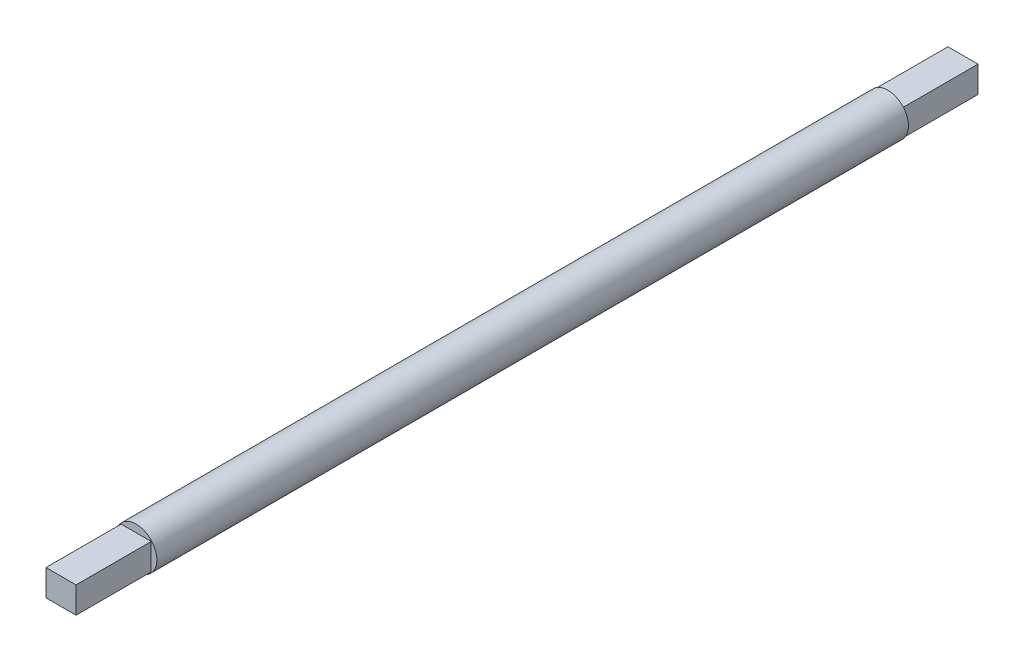
ISO-10303-21;
HEADER;
FILE_DESCRIPTION(('STEP AP214'),'2;1');
FILE_NAME('part.step','',(''),(''),'','','');
FILE_SCHEMA(('AUTOMOTIVE_DESIGN { 1 0 10303 214 1 1 1 1 }'));
ENDSEC;
DATA;
#1=APPLICATION_CONTEXT('core data for automotive mechanical design processes');
#2=APPLICATION_PROTOCOL_DEFINITION('international standard','automotive_design',2000,#1);
#3=PRODUCT_CONTEXT('',#1,'mechanical');
#4=PRODUCT('Part','Part','',(#3));
#5=PRODUCT_RELATED_PRODUCT_CATEGORY('part','',(#4));
#6=PRODUCT_DEFINITION_FORMATION('','',#4);
#7=PRODUCT_DEFINITION_CONTEXT('part definition',#1,'design');
#8=PRODUCT_DEFINITION('design','',#6,#7);
#9=PRODUCT_DEFINITION_SHAPE('','',#8);
#10=(LENGTH_UNIT() NAMED_UNIT(*) SI_UNIT(.MILLI.,.METRE.));
#11=(NAMED_UNIT(*) PLANE_ANGLE_UNIT() SI_UNIT($,.RADIAN.));
#12=(NAMED_UNIT(*) SI_UNIT($,.STERADIAN.) SOLID_ANGLE_UNIT());
#13=UNCERTAINTY_MEASURE_WITH_UNIT(LENGTH_MEASURE(1.E-05),#10,'distance_accuracy_value','');
#14=(GEOMETRIC_REPRESENTATION_CONTEXT(3) GLOBAL_UNCERTAINTY_ASSIGNED_CONTEXT((#13)) GLOBAL_UNIT_ASSIGNED_CONTEXT((#10,
#11,#12)) REPRESENTATION_CONTEXT('',''));
#15=CARTESIAN_POINT('',(0.,0.,0.));
#16=DIRECTION('',(0.,0.,1.));
#17=DIRECTION('',(1.,0.,0.));
#18=AXIS2_PLACEMENT_3D('',#15,#16,#17);
#19=CARTESIAN_POINT('',(0.,0.,0.));
#20=DIRECTION('',(0.,0.,1.));
#21=DIRECTION('',(1.,0.,0.));
#22=AXIS2_PLACEMENT_3D('',#19,#20,#21);
#23=PLANE('',#22);
#24=CARTESIAN_POINT('',(0.,0.,0.));
#25=DIRECTION('',(0.,0.,1.));
#26=DIRECTION('',(1.,0.,0.));
#27=AXIS2_PLACEMENT_3D('',#24,#25,#26);
#28=CIRCLE('',#27,2.75);
#29=CARTESIAN_POINT('',(2.75,0.,0.));
#30=VERTEX_POINT('',#29);
#31=EDGE_CURVE('E37',#30,#30,#28,.T.);
#32=ORIENTED_EDGE('',*,*,#31,.F.);
#33=EDGE_LOOP('',(#32));
#34=FACE_BOUND('',#33,.T.);
#35=DIRECTION('',(0.,-1.,0.));
#36=VECTOR('',#35,1.);
#37=CARTESIAN_POINT('',(2.,1.75,0.));
#38=LINE('',#37,#36);
#39=CARTESIAN_POINT('',(2.,1.75,0.));
#40=VERTEX_POINT('',#39);
#41=CARTESIAN_POINT('',(2.,-1.75,0.));
#42=VERTEX_POINT('',#41);
#43=EDGE_CURVE('E118',#40,#42,#38,.T.);
#44=ORIENTED_EDGE('',*,*,#43,.F.);
#45=DIRECTION('',(1.,0.,0.));
#46=VECTOR('',#45,1.);
#47=CARTESIAN_POINT('',(2.,1.75,0.));
#48=LINE('',#47,#46);
#49=CARTESIAN_POINT('',(-2.,1.75,0.));
#50=VERTEX_POINT('',#49);
#51=EDGE_CURVE('E115',#50,#40,#48,.T.);
#52=ORIENTED_EDGE('',*,*,#51,.F.);
#53=DIRECTION('',(0.,1.,0.));
#54=VECTOR('',#53,1.);
#55=CARTESIAN_POINT('',(-2.,1.75,0.));
#56=LINE('',#55,#54);
#57=CARTESIAN_POINT('',(-2.,-1.75,0.));
#58=VERTEX_POINT('',#57);
#59=EDGE_CURVE('E53',#58,#50,#56,.T.);
#60=ORIENTED_EDGE('',*,*,#59,.F.);
#61=DIRECTION('',(-1.,0.,0.));
#62=VECTOR('',#61,1.);
#63=CARTESIAN_POINT('',(2.,-1.75,0.));
#64=LINE('',#63,#62);
#65=EDGE_CURVE('E48',#42,#58,#64,.T.);
#66=ORIENTED_EDGE('',*,*,#65,.F.);
#67=EDGE_LOOP('',(#44,#52,#60,#66));
#68=FACE_BOUND('',#67,.T.);
#69=ADVANCED_FACE('F33',(#34,#68),#23,.F.);
#70=CARTESIAN_POINT('',(0.,0.,100.));
#71=DIRECTION('',(0.,0.,1.));
#72=DIRECTION('',(1.,0.,0.));
#73=AXIS2_PLACEMENT_3D('',#70,#71,#72);
#74=PLANE('',#73);
#75=CARTESIAN_POINT('',(0.,0.,100.));
#76=DIRECTION('',(0.,0.,1.));
#77=DIRECTION('',(1.,0.,0.));
#78=AXIS2_PLACEMENT_3D('',#75,#76,#77);
#79=CIRCLE('',#78,2.75);
#80=CARTESIAN_POINT('',(2.75,0.,100.));
#81=VERTEX_POINT('',#80);
#82=EDGE_CURVE('E11',#81,#81,#79,.T.);
#83=ORIENTED_EDGE('',*,*,#82,.T.);
#84=EDGE_LOOP('',(#83));
#85=FACE_BOUND('',#84,.T.);
#86=DIRECTION('',(1.,0.,0.));
#87=VECTOR('',#86,1.);
#88=CARTESIAN_POINT('',(-2.,-1.75,100.));
#89=LINE('',#88,#87);
#90=CARTESIAN_POINT('',(-2.,-1.75,100.));
#91=VERTEX_POINT('',#90);
#92=CARTESIAN_POINT('',(2.,-1.75,100.));
#93=VERTEX_POINT('',#92);
#94=EDGE_CURVE('E122',#91,#93,#89,.T.);
#95=ORIENTED_EDGE('',*,*,#94,.F.);
#96=DIRECTION('',(0.,-1.,0.));
#97=VECTOR('',#96,1.);
#98=CARTESIAN_POINT('',(-2.,1.75,100.));
#99=LINE('',#98,#97);
#100=CARTESIAN_POINT('',(-2.,1.75,100.));
#101=VERTEX_POINT('',#100);
#102=EDGE_CURVE('E119',#101,#91,#99,.T.);
#103=ORIENTED_EDGE('',*,*,#102,.F.);
#104=DIRECTION('',(-1.,0.,0.));
#105=VECTOR('',#104,1.);
#106=CARTESIAN_POINT('',(-2.,1.75,100.));
#107=LINE('',#106,#105);
#108=CARTESIAN_POINT('',(2.,1.75,100.));
#109=VERTEX_POINT('',#108);
#110=EDGE_CURVE('E132',#109,#101,#107,.T.);
#111=ORIENTED_EDGE('',*,*,#110,.F.);
#112=DIRECTION('',(0.,1.,0.));
#113=VECTOR('',#112,1.);
#114=CARTESIAN_POINT('',(2.,1.75,100.));
#115=LINE('',#114,#113);
#116=EDGE_CURVE('E140',#93,#109,#115,.T.);
#117=ORIENTED_EDGE('',*,*,#116,.F.);
#118=EDGE_LOOP('',(#95,#103,#111,#117));
#119=FACE_BOUND('',#118,.T.);
#120=ADVANCED_FACE('F159',(#85,#119),#74,.T.);
#121=CARTESIAN_POINT('',(0.,0.,100.));
#122=DIRECTION('',(0.,0.,-1.));
#123=DIRECTION('',(-1.,0.,0.));
#124=AXIS2_PLACEMENT_3D('',#121,#122,#123);
#125=CYLINDRICAL_SURFACE('',#124,2.75);
#126=ORIENTED_EDGE('',*,*,#82,.F.);
#127=EDGE_LOOP('',(#126));
#128=FACE_BOUND('',#127,.T.);
#129=ORIENTED_EDGE('',*,*,#31,.T.);
#130=EDGE_LOOP('',(#129));
#131=FACE_BOUND('',#130,.T.);
#132=ADVANCED_FACE('F35',(#128,#131),#125,.T.);
#133=CARTESIAN_POINT('',(-2.,1.75,110.));
#134=DIRECTION('',(1.,0.,0.));
#135=DIRECTION('',(0.,1.,0.));
#136=AXIS2_PLACEMENT_3D('',#133,#134,#135);
#137=PLANE('',#136);
#138=ORIENTED_EDGE('',*,*,#102,.T.);
#139=DIRECTION('',(0.,0.,-1.));
#140=VECTOR('',#139,1.);
#141=CARTESIAN_POINT('',(-2.,-1.75,110.));
#142=LINE('',#141,#140);
#143=CARTESIAN_POINT('',(-2.,-1.75,110.));
#144=VERTEX_POINT('',#143);
#145=EDGE_CURVE('E151',#144,#91,#142,.T.);
#146=ORIENTED_EDGE('',*,*,#145,.F.);
#147=DIRECTION('',(0.,-1.,0.));
#148=VECTOR('',#147,1.);
#149=CARTESIAN_POINT('',(-2.,1.75,110.));
#150=LINE('',#149,#148);
#151=CARTESIAN_POINT('',(-2.,1.75,110.));
#152=VERTEX_POINT('',#151);
#153=EDGE_CURVE('E128',#152,#144,#150,.T.);
#154=ORIENTED_EDGE('',*,*,#153,.F.);
#155=DIRECTION('',(0.,0.,-1.));
#156=VECTOR('',#155,1.);
#157=CARTESIAN_POINT('',(-2.,1.75,110.));
#158=LINE('',#157,#156);
#159=EDGE_CURVE('E137',#152,#101,#158,.T.);
#160=ORIENTED_EDGE('',*,*,#159,.T.);
#161=EDGE_LOOP('',(#138,#146,#154,#160));
#162=FACE_BOUND('',#161,.T.);
#163=ADVANCED_FACE('F202',(#162),#137,.F.);
#164=CARTESIAN_POINT('',(-2.,-1.75,110.));
#165=DIRECTION('',(0.,1.,0.));
#166=DIRECTION('',(0.,0.,1.));
#167=AXIS2_PLACEMENT_3D('',#164,#165,#166);
#168=PLANE('',#167);
#169=ORIENTED_EDGE('',*,*,#94,.T.);
#170=DIRECTION('',(0.,0.,-1.));
#171=VECTOR('',#170,1.);
#172=CARTESIAN_POINT('',(2.,-1.75,110.));
#173=LINE('',#172,#171);
#174=CARTESIAN_POINT('',(2.,-1.75,110.));
#175=VERTEX_POINT('',#174);
#176=EDGE_CURVE('E148',#175,#93,#173,.T.);
#177=ORIENTED_EDGE('',*,*,#176,.F.);
#178=DIRECTION('',(1.,0.,0.));
#179=VECTOR('',#178,1.);
#180=CARTESIAN_POINT('',(-2.,-1.75,110.));
#181=LINE('',#180,#179);
#182=EDGE_CURVE('E131',#144,#175,#181,.T.);
#183=ORIENTED_EDGE('',*,*,#182,.F.);
#184=ORIENTED_EDGE('',*,*,#145,.T.);
#185=EDGE_LOOP('',(#169,#177,#183,#184));
#186=FACE_BOUND('',#185,.T.);
#187=ADVANCED_FACE('F198',(#186),#168,.F.);
#188=CARTESIAN_POINT('',(2.,1.75,110.));
#189=DIRECTION('',(-1.,0.,0.));
#190=DIRECTION('',(0.,0.,1.));
#191=AXIS2_PLACEMENT_3D('',#188,#189,#190);
#192=PLANE('',#191);
#193=ORIENTED_EDGE('',*,*,#116,.T.);
#194=DIRECTION('',(0.,0.,-1.));
#195=VECTOR('',#194,1.);
#196=CARTESIAN_POINT('',(2.,1.75,110.));
#197=LINE('',#196,#195);
#198=CARTESIAN_POINT('',(2.,1.75,110.));
#199=VERTEX_POINT('',#198);
#200=EDGE_CURVE('E146',#199,#109,#197,.T.);
#201=ORIENTED_EDGE('',*,*,#200,.F.);
#202=DIRECTION('',(0.,1.,0.));
#203=VECTOR('',#202,1.);
#204=CARTESIAN_POINT('',(2.,1.75,110.));
#205=LINE('',#204,#203);
#206=EDGE_CURVE('E134',#175,#199,#205,.T.);
#207=ORIENTED_EDGE('',*,*,#206,.F.);
#208=ORIENTED_EDGE('',*,*,#176,.T.);
#209=EDGE_LOOP('',(#193,#201,#207,#208));
#210=FACE_BOUND('',#209,.T.);
#211=ADVANCED_FACE('F194',(#210),#192,.F.);
#212=CARTESIAN_POINT('',(-2.,1.75,110.));
#213=DIRECTION('',(0.,-1.,0.));
#214=DIRECTION('',(0.,0.,-1.));
#215=AXIS2_PLACEMENT_3D('',#212,#213,#214);
#216=PLANE('',#215);
#217=ORIENTED_EDGE('',*,*,#110,.T.);
#218=ORIENTED_EDGE('',*,*,#159,.F.);
#219=DIRECTION('',(-1.,0.,0.));
#220=VECTOR('',#219,1.);
#221=CARTESIAN_POINT('',(-2.,1.75,110.));
#222=LINE('',#221,#220);
#223=EDGE_CURVE('E136',#199,#152,#222,.T.);
#224=ORIENTED_EDGE('',*,*,#223,.F.);
#225=ORIENTED_EDGE('',*,*,#200,.T.);
#226=EDGE_LOOP('',(#217,#218,#224,#225));
#227=FACE_BOUND('',#226,.T.);
#228=ADVANCED_FACE('F190',(#227),#216,.F.);
#229=CARTESIAN_POINT('',(0.,0.,110.));
#230=DIRECTION('',(0.,0.,1.));
#231=DIRECTION('',(1.,0.,0.));
#232=AXIS2_PLACEMENT_3D('',#229,#230,#231);
#233=PLANE('',#232);
#234=ORIENTED_EDGE('',*,*,#153,.T.);
#235=ORIENTED_EDGE('',*,*,#182,.T.);
#236=ORIENTED_EDGE('',*,*,#206,.T.);
#237=ORIENTED_EDGE('',*,*,#223,.T.);
#238=EDGE_LOOP('',(#234,#235,#236,#237));
#239=FACE_BOUND('',#238,.T.);
#240=ADVANCED_FACE('F187',(#239),#233,.T.);
#241=CARTESIAN_POINT('',(2.,1.75,-10.));
#242=DIRECTION('',(-1.,0.,0.));
#243=DIRECTION('',(0.,-1.,0.));
#244=AXIS2_PLACEMENT_3D('',#241,#242,#243);
#245=PLANE('',#244);
#246=ORIENTED_EDGE('',*,*,#43,.T.);
#247=DIRECTION('',(0.,0.,1.));
#248=VECTOR('',#247,1.);
#249=CARTESIAN_POINT('',(2.,-1.75,-10.));
#250=LINE('',#249,#248);
#251=CARTESIAN_POINT('',(2.,-1.75,-10.));
#252=VERTEX_POINT('',#251);
#253=EDGE_CURVE('E99',#252,#42,#250,.T.);
#254=ORIENTED_EDGE('',*,*,#253,.F.);
#255=DIRECTION('',(0.,-1.,0.));
#256=VECTOR('',#255,1.);
#257=CARTESIAN_POINT('',(2.,1.75,-10.));
#258=LINE('',#257,#256);
#259=CARTESIAN_POINT('',(2.,1.75,-10.));
#260=VERTEX_POINT('',#259);
#261=EDGE_CURVE('E106',#260,#252,#258,.T.);
#262=ORIENTED_EDGE('',*,*,#261,.F.);
#263=DIRECTION('',(0.,0.,1.));
#264=VECTOR('',#263,1.);
#265=CARTESIAN_POINT('',(2.,1.75,-10.));
#266=LINE('',#265,#264);
#267=EDGE_CURVE('E165',#260,#40,#266,.T.);
#268=ORIENTED_EDGE('',*,*,#267,.T.);
#269=EDGE_LOOP('',(#246,#254,#262,#268));
#270=FACE_BOUND('',#269,.T.);
#271=ADVANCED_FACE('F117',(#270),#245,.F.);
#272=CARTESIAN_POINT('',(2.,-1.75,-10.));
#273=DIRECTION('',(0.,1.,0.));
#274=DIRECTION('',(0.,0.,1.));
#275=AXIS2_PLACEMENT_3D('',#272,#273,#274);
#276=PLANE('',#275);
#277=ORIENTED_EDGE('',*,*,#65,.T.);
#278=DIRECTION('',(0.,0.,1.));
#279=VECTOR('',#278,1.);
#280=CARTESIAN_POINT('',(-2.,-1.75,-10.));
#281=LINE('',#280,#279);
#282=CARTESIAN_POINT('',(-2.,-1.75,-10.));
#283=VERTEX_POINT('',#282);
#284=EDGE_CURVE('E102',#283,#58,#281,.T.);
#285=ORIENTED_EDGE('',*,*,#284,.F.);
#286=DIRECTION('',(-1.,0.,0.));
#287=VECTOR('',#286,1.);
#288=CARTESIAN_POINT('',(2.,-1.75,-10.));
#289=LINE('',#288,#287);
#290=EDGE_CURVE('E95',#252,#283,#289,.T.);
#291=ORIENTED_EDGE('',*,*,#290,.F.);
#292=ORIENTED_EDGE('',*,*,#253,.T.);
#293=EDGE_LOOP('',(#277,#285,#291,#292));
#294=FACE_BOUND('',#293,.T.);
#295=ADVANCED_FACE('F97',(#294),#276,.F.);
#296=CARTESIAN_POINT('',(-2.,1.75,-10.));
#297=DIRECTION('',(1.,0.,0.));
#298=DIRECTION('',(0.,1.,0.));
#299=AXIS2_PLACEMENT_3D('',#296,#297,#298);
#300=PLANE('',#299);
#301=ORIENTED_EDGE('',*,*,#59,.T.);
#302=DIRECTION('',(0.,0.,1.));
#303=VECTOR('',#302,1.);
#304=CARTESIAN_POINT('',(-2.,1.75,-10.));
#305=LINE('',#304,#303);
#306=CARTESIAN_POINT('',(-2.,1.75,-10.));
#307=VERTEX_POINT('',#306);
#308=EDGE_CURVE('E124',#307,#50,#305,.T.);
#309=ORIENTED_EDGE('',*,*,#308,.F.);
#310=DIRECTION('',(0.,1.,0.));
#311=VECTOR('',#310,1.);
#312=CARTESIAN_POINT('',(-2.,1.75,-10.));
#313=LINE('',#312,#311);
#314=EDGE_CURVE('E105',#283,#307,#313,.T.);
#315=ORIENTED_EDGE('',*,*,#314,.F.);
#316=ORIENTED_EDGE('',*,*,#284,.T.);
#317=EDGE_LOOP('',(#301,#309,#315,#316));
#318=FACE_BOUND('',#317,.T.);
#319=ADVANCED_FACE('F174',(#318),#300,.F.);
#320=CARTESIAN_POINT('',(2.,1.75,-10.));
#321=DIRECTION('',(0.,-1.,0.));
#322=DIRECTION('',(1.,0.,0.));
#323=AXIS2_PLACEMENT_3D('',#320,#321,#322);
#324=PLANE('',#323);
#325=ORIENTED_EDGE('',*,*,#51,.T.);
#326=ORIENTED_EDGE('',*,*,#267,.F.);
#327=DIRECTION('',(1.,0.,0.));
#328=VECTOR('',#327,1.);
#329=CARTESIAN_POINT('',(2.,1.75,-10.));
#330=LINE('',#329,#328);
#331=EDGE_CURVE('E111',#307,#260,#330,.T.);
#332=ORIENTED_EDGE('',*,*,#331,.F.);
#333=ORIENTED_EDGE('',*,*,#308,.T.);
#334=EDGE_LOOP('',(#325,#326,#332,#333));
#335=FACE_BOUND('',#334,.T.);
#336=ADVANCED_FACE('F164',(#335),#324,.F.);
#337=CARTESIAN_POINT('',(0.,0.,-10.));
#338=DIRECTION('',(0.,0.,-1.));
#339=DIRECTION('',(-1.,0.,0.));
#340=AXIS2_PLACEMENT_3D('',#337,#338,#339);
#341=PLANE('',#340);
#342=ORIENTED_EDGE('',*,*,#261,.T.);
#343=ORIENTED_EDGE('',*,*,#290,.T.);
#344=ORIENTED_EDGE('',*,*,#314,.T.);
#345=ORIENTED_EDGE('',*,*,#331,.T.);
#346=EDGE_LOOP('',(#342,#343,#344,#345));
#347=FACE_BOUND('',#346,.T.);
#348=ADVANCED_FACE('F109',(#347),#341,.T.);
#349=CLOSED_SHELL('',(#69,#120,#132,#163,#187,#211,#228,#240,#271,#295,#319,#336,#348));
#350=MANIFOLD_SOLID_BREP('B2',#349);
#351=ADVANCED_BREP_SHAPE_REPRESENTATION('',(#18,#350),#14);
#352=SHAPE_DEFINITION_REPRESENTATION(#9,#351);
ENDSEC;
END-ISO-10303-21;
